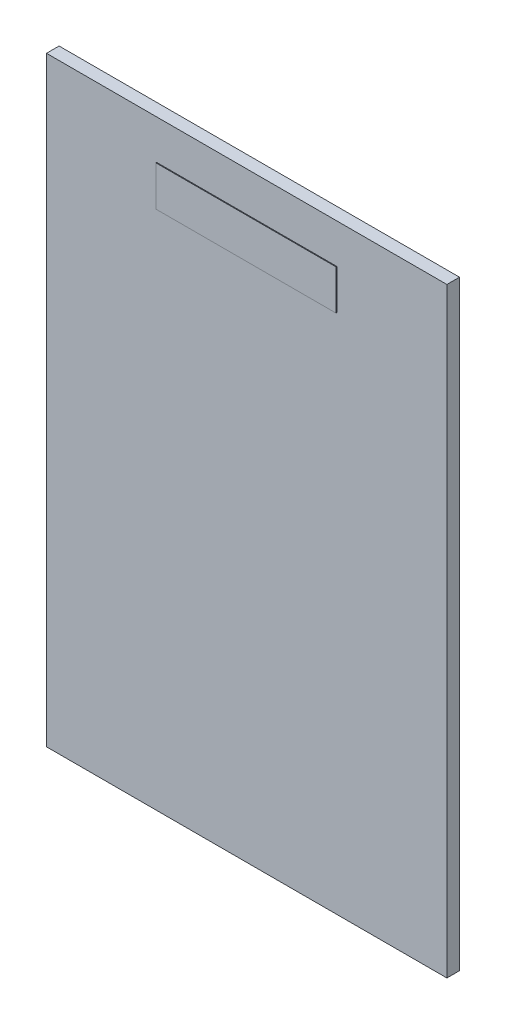
ISO-10303-21;
HEADER;
FILE_DESCRIPTION(('STEP AP214'),'2;1');
FILE_NAME('part.step','',(''),(''),'','','');
FILE_SCHEMA(('AUTOMOTIVE_DESIGN { 1 0 10303 214 1 1 1 1 }'));
ENDSEC;
DATA;
#1=APPLICATION_CONTEXT('core data for automotive mechanical design processes');
#2=APPLICATION_PROTOCOL_DEFINITION('international standard','automotive_design',2000,#1);
#3=PRODUCT_CONTEXT('',#1,'mechanical');
#4=PRODUCT('Part','Part','',(#3));
#5=PRODUCT_RELATED_PRODUCT_CATEGORY('part','',(#4));
#6=PRODUCT_DEFINITION_FORMATION('','',#4);
#7=PRODUCT_DEFINITION_CONTEXT('part definition',#1,'design');
#8=PRODUCT_DEFINITION('design','',#6,#7);
#9=PRODUCT_DEFINITION_SHAPE('','',#8);
#10=(LENGTH_UNIT() NAMED_UNIT(*) SI_UNIT(.MILLI.,.METRE.));
#11=(NAMED_UNIT(*) PLANE_ANGLE_UNIT() SI_UNIT($,.RADIAN.));
#12=(NAMED_UNIT(*) SI_UNIT($,.STERADIAN.) SOLID_ANGLE_UNIT());
#13=UNCERTAINTY_MEASURE_WITH_UNIT(LENGTH_MEASURE(1.E-05),#10,'distance_accuracy_value','');
#14=(GEOMETRIC_REPRESENTATION_CONTEXT(3) GLOBAL_UNCERTAINTY_ASSIGNED_CONTEXT((#13)) GLOBAL_UNIT_ASSIGNED_CONTEXT((#10,
#11,#12)) REPRESENTATION_CONTEXT('',''));
#15=CARTESIAN_POINT('',(0.,0.,0.));
#16=DIRECTION('',(0.,0.,1.));
#17=DIRECTION('',(1.,0.,0.));
#18=AXIS2_PLACEMENT_3D('',#15,#16,#17);
#19=CARTESIAN_POINT('',(0.,0.,0.));
#20=DIRECTION('',(0.,0.,1.));
#21=DIRECTION('',(1.,0.,0.));
#22=AXIS2_PLACEMENT_3D('',#19,#20,#21);
#23=PLANE('',#22);
#24=DIRECTION('',(0.,-1.,0.));
#25=VECTOR('',#24,1.);
#26=CARTESIAN_POINT('',(-25.4,-38.1,0.));
#27=LINE('',#26,#25);
#28=CARTESIAN_POINT('',(-25.4,38.1,0.));
#29=VERTEX_POINT('',#28);
#30=CARTESIAN_POINT('',(-25.4,-38.1,0.));
#31=VERTEX_POINT('',#30);
#32=EDGE_CURVE('E201',#29,#31,#27,.T.);
#33=ORIENTED_EDGE('',*,*,#32,.F.);
#34=DIRECTION('',(-1.,0.,0.));
#35=VECTOR('',#34,1.);
#36=CARTESIAN_POINT('',(25.4,38.1,0.));
#37=LINE('',#36,#35);
#38=CARTESIAN_POINT('',(25.4,38.1,0.));
#39=VERTEX_POINT('',#38);
#40=EDGE_CURVE('E207',#39,#29,#37,.T.);
#41=ORIENTED_EDGE('',*,*,#40,.F.);
#42=DIRECTION('',(0.,1.,0.));
#43=VECTOR('',#42,1.);
#44=CARTESIAN_POINT('',(25.4,-38.1,0.));
#45=LINE('',#44,#43);
#46=CARTESIAN_POINT('',(25.4,-38.1,0.));
#47=VERTEX_POINT('',#46);
#48=EDGE_CURVE('E223',#47,#39,#45,.T.);
#49=ORIENTED_EDGE('',*,*,#48,.F.);
#50=DIRECTION('',(1.,0.,0.));
#51=VECTOR('',#50,1.);
#52=CARTESIAN_POINT('',(25.4,-38.1,0.));
#53=LINE('',#52,#51);
#54=EDGE_CURVE('E220',#31,#47,#53,.T.);
#55=ORIENTED_EDGE('',*,*,#54,.F.);
#56=EDGE_LOOP('',(#33,#41,#49,#55));
#57=FACE_BOUND('',#56,.T.);
#58=DIRECTION('',(0.,-1.,0.));
#59=VECTOR('',#58,1.);
#60=CARTESIAN_POINT('',(14.2785809877324,-19.2782572597997,0.));
#61=LINE('',#60,#59);
#62=CARTESIAN_POINT('',(14.2785809877324,22.7351751149428,0.));
#63=VERTEX_POINT('',#62);
#64=CARTESIAN_POINT('',(14.2785809877324,-19.2782572597997,0.));
#65=VERTEX_POINT('',#64);
#66=EDGE_CURVE('E57',#63,#65,#61,.T.);
#67=ORIENTED_EDGE('',*,*,#66,.F.);
#68=DIRECTION('',(1.,0.,0.));
#69=VECTOR('',#68,1.);
#70=CARTESIAN_POINT('',(-14.2785809877324,22.7351751149428,0.));
#71=LINE('',#70,#69);
#72=CARTESIAN_POINT('',(-14.2785809877324,22.7351751149428,0.));
#73=VERTEX_POINT('',#72);
#74=EDGE_CURVE('E61',#73,#63,#71,.T.);
#75=ORIENTED_EDGE('',*,*,#74,.F.);
#76=DIRECTION('',(0.,1.,0.));
#77=VECTOR('',#76,1.);
#78=CARTESIAN_POINT('',(-14.2785809877324,-19.2782572597997,0.));
#79=LINE('',#78,#77);
#80=CARTESIAN_POINT('',(-14.2785809877324,-19.2782572597997,0.));
#81=VERTEX_POINT('',#80);
#82=EDGE_CURVE('E401',#81,#73,#79,.T.);
#83=ORIENTED_EDGE('',*,*,#82,.F.);
#84=DIRECTION('',(-1.,0.,0.));
#85=VECTOR('',#84,1.);
#86=CARTESIAN_POINT('',(-14.2785809877324,-19.2782572597997,0.));
#87=LINE('',#86,#85);
#88=EDGE_CURVE('E411',#65,#81,#87,.T.);
#89=ORIENTED_EDGE('',*,*,#88,.F.);
#90=EDGE_LOOP('',(#67,#75,#83,#89));
#91=FACE_BOUND('',#90,.T.);
#92=ADVANCED_FACE('F41',(#57,#91),#23,.F.);
#93=CARTESIAN_POINT('',(0.,0.,1.6));
#94=DIRECTION('',(0.,0.,1.));
#95=DIRECTION('',(1.,0.,0.));
#96=AXIS2_PLACEMENT_3D('',#93,#94,#95);
#97=PLANE('',#96);
#98=DIRECTION('',(0.,-1.,0.));
#99=VECTOR('',#98,1.);
#100=CARTESIAN_POINT('',(-25.4,-38.1,1.6));
#101=LINE('',#100,#99);
#102=CARTESIAN_POINT('',(-25.4,38.1,1.6));
#103=VERTEX_POINT('',#102);
#104=CARTESIAN_POINT('',(-25.4,-38.1,1.6));
#105=VERTEX_POINT('',#104);
#106=EDGE_CURVE('E202',#103,#105,#101,.T.);
#107=ORIENTED_EDGE('',*,*,#106,.T.);
#108=DIRECTION('',(1.,0.,0.));
#109=VECTOR('',#108,1.);
#110=CARTESIAN_POINT('',(25.4,-38.1,1.6));
#111=LINE('',#110,#109);
#112=CARTESIAN_POINT('',(25.4,-38.1,1.6));
#113=VERTEX_POINT('',#112);
#114=EDGE_CURVE('E206',#105,#113,#111,.T.);
#115=ORIENTED_EDGE('',*,*,#114,.T.);
#116=DIRECTION('',(0.,1.,0.));
#117=VECTOR('',#116,1.);
#118=CARTESIAN_POINT('',(25.4,-38.1,1.6));
#119=LINE('',#118,#117);
#120=CARTESIAN_POINT('',(25.4,38.1,1.6));
#121=VERTEX_POINT('',#120);
#122=EDGE_CURVE('E210',#113,#121,#119,.T.);
#123=ORIENTED_EDGE('',*,*,#122,.T.);
#124=DIRECTION('',(-1.,0.,0.));
#125=VECTOR('',#124,1.);
#126=CARTESIAN_POINT('',(25.4,38.1,1.6));
#127=LINE('',#126,#125);
#128=EDGE_CURVE('E213',#121,#103,#127,.T.);
#129=ORIENTED_EDGE('',*,*,#128,.T.);
#130=EDGE_LOOP('',(#107,#115,#123,#129));
#131=FACE_BOUND('',#130,.T.);
#132=DIRECTION('',(-1.,0.,0.));
#133=VECTOR('',#132,1.);
#134=CARTESIAN_POINT('',(-11.43,33.1,1.6));
#135=LINE('',#134,#133);
#136=CARTESIAN_POINT('',(11.43,33.1,1.6));
#137=VERTEX_POINT('',#136);
#138=CARTESIAN_POINT('',(-11.43,33.1,1.6));
#139=VERTEX_POINT('',#138);
#140=EDGE_CURVE('E159',#137,#139,#135,.T.);
#141=ORIENTED_EDGE('',*,*,#140,.F.);
#142=DIRECTION('',(0.,1.,0.));
#143=VECTOR('',#142,1.);
#144=CARTESIAN_POINT('',(11.43,28.02,1.6));
#145=LINE('',#144,#143);
#146=CARTESIAN_POINT('',(11.43,28.02,1.6));
#147=VERTEX_POINT('',#146);
#148=EDGE_CURVE('E154',#147,#137,#145,.T.);
#149=ORIENTED_EDGE('',*,*,#148,.F.);
#150=DIRECTION('',(1.,0.,0.));
#151=VECTOR('',#150,1.);
#152=CARTESIAN_POINT('',(-11.43,28.02,1.6));
#153=LINE('',#152,#151);
#154=CARTESIAN_POINT('',(-11.43,28.02,1.6));
#155=VERTEX_POINT('',#154);
#156=EDGE_CURVE('E170',#155,#147,#153,.T.);
#157=ORIENTED_EDGE('',*,*,#156,.F.);
#158=DIRECTION('',(0.,-1.,0.));
#159=VECTOR('',#158,1.);
#160=CARTESIAN_POINT('',(-11.43,28.02,1.6));
#161=LINE('',#160,#159);
#162=EDGE_CURVE('E182',#139,#155,#161,.T.);
#163=ORIENTED_EDGE('',*,*,#162,.F.);
#164=EDGE_LOOP('',(#141,#149,#157,#163));
#165=FACE_BOUND('',#164,.T.);
#166=ADVANCED_FACE('F254',(#131,#165),#97,.T.);
#167=CARTESIAN_POINT('',(-25.4,-38.1,1.6));
#168=DIRECTION('',(1.,0.,0.));
#169=DIRECTION('',(0.,0.,-1.));
#170=AXIS2_PLACEMENT_3D('',#167,#168,#169);
#171=PLANE('',#170);
#172=ORIENTED_EDGE('',*,*,#32,.T.);
#173=DIRECTION('',(0.,0.,-1.));
#174=VECTOR('',#173,1.);
#175=CARTESIAN_POINT('',(-25.4,-38.1,1.6));
#176=LINE('',#175,#174);
#177=EDGE_CURVE('E11',#105,#31,#176,.T.);
#178=ORIENTED_EDGE('',*,*,#177,.F.);
#179=ORIENTED_EDGE('',*,*,#106,.F.);
#180=DIRECTION('',(0.,0.,-1.));
#181=VECTOR('',#180,1.);
#182=CARTESIAN_POINT('',(-25.4,38.1,1.6));
#183=LINE('',#182,#181);
#184=EDGE_CURVE('E216',#103,#29,#183,.T.);
#185=ORIENTED_EDGE('',*,*,#184,.T.);
#186=EDGE_LOOP('',(#172,#178,#179,#185));
#187=FACE_BOUND('',#186,.T.);
#188=ADVANCED_FACE('F43',(#187),#171,.F.);
#189=CARTESIAN_POINT('',(25.4,-38.1,1.6));
#190=DIRECTION('',(0.,1.,0.));
#191=DIRECTION('',(-1.,0.,0.));
#192=AXIS2_PLACEMENT_3D('',#189,#190,#191);
#193=PLANE('',#192);
#194=ORIENTED_EDGE('',*,*,#54,.T.);
#195=DIRECTION('',(0.,0.,-1.));
#196=VECTOR('',#195,1.);
#197=CARTESIAN_POINT('',(25.4,-38.1,1.6));
#198=LINE('',#197,#196);
#199=EDGE_CURVE('E50',#113,#47,#198,.T.);
#200=ORIENTED_EDGE('',*,*,#199,.F.);
#201=ORIENTED_EDGE('',*,*,#114,.F.);
#202=ORIENTED_EDGE('',*,*,#177,.T.);
#203=EDGE_LOOP('',(#194,#200,#201,#202));
#204=FACE_BOUND('',#203,.T.);
#205=ADVANCED_FACE('F256',(#204),#193,.F.);
#206=CARTESIAN_POINT('',(25.4,-38.1,1.6));
#207=DIRECTION('',(-1.,0.,0.));
#208=DIRECTION('',(0.,0.,1.));
#209=AXIS2_PLACEMENT_3D('',#206,#207,#208);
#210=PLANE('',#209);
#211=ORIENTED_EDGE('',*,*,#48,.T.);
#212=DIRECTION('',(0.,0.,-1.));
#213=VECTOR('',#212,1.);
#214=CARTESIAN_POINT('',(25.4,38.1,1.6));
#215=LINE('',#214,#213);
#216=EDGE_CURVE('E231',#121,#39,#215,.T.);
#217=ORIENTED_EDGE('',*,*,#216,.F.);
#218=ORIENTED_EDGE('',*,*,#122,.F.);
#219=ORIENTED_EDGE('',*,*,#199,.T.);
#220=EDGE_LOOP('',(#211,#217,#218,#219));
#221=FACE_BOUND('',#220,.T.);
#222=ADVANCED_FACE('F240',(#221),#210,.F.);
#223=CARTESIAN_POINT('',(25.4,38.1,1.6));
#224=DIRECTION('',(0.,-1.,0.));
#225=DIRECTION('',(0.,0.,-1.));
#226=AXIS2_PLACEMENT_3D('',#223,#224,#225);
#227=PLANE('',#226);
#228=ORIENTED_EDGE('',*,*,#40,.T.);
#229=ORIENTED_EDGE('',*,*,#184,.F.);
#230=ORIENTED_EDGE('',*,*,#128,.F.);
#231=ORIENTED_EDGE('',*,*,#216,.T.);
#232=EDGE_LOOP('',(#228,#229,#230,#231));
#233=FACE_BOUND('',#232,.T.);
#234=ADVANCED_FACE('F248',(#233),#227,.F.);
#235=CARTESIAN_POINT('',(11.43,28.02,1.7));
#236=DIRECTION('',(-1.,0.,0.));
#237=DIRECTION('',(0.,0.,1.));
#238=AXIS2_PLACEMENT_3D('',#235,#236,#237);
#239=PLANE('',#238);
#240=ORIENTED_EDGE('',*,*,#148,.T.);
#241=DIRECTION('',(0.,0.,-1.));
#242=VECTOR('',#241,1.);
#243=CARTESIAN_POINT('',(11.43,33.1,1.7));
#244=LINE('',#243,#242);
#245=CARTESIAN_POINT('',(11.43,33.1,1.7));
#246=VERTEX_POINT('',#245);
#247=EDGE_CURVE('E198',#246,#137,#244,.T.);
#248=ORIENTED_EDGE('',*,*,#247,.F.);
#249=DIRECTION('',(0.,1.,0.));
#250=VECTOR('',#249,1.);
#251=CARTESIAN_POINT('',(11.43,28.02,1.7));
#252=LINE('',#251,#250);
#253=CARTESIAN_POINT('',(11.43,28.02,1.7));
#254=VERTEX_POINT('',#253);
#255=EDGE_CURVE('E165',#254,#246,#252,.T.);
#256=ORIENTED_EDGE('',*,*,#255,.F.);
#257=DIRECTION('',(0.,0.,-1.));
#258=VECTOR('',#257,1.);
#259=CARTESIAN_POINT('',(11.43,28.02,1.7));
#260=LINE('',#259,#258);
#261=EDGE_CURVE('E178',#254,#147,#260,.T.);
#262=ORIENTED_EDGE('',*,*,#261,.T.);
#263=EDGE_LOOP('',(#240,#248,#256,#262));
#264=FACE_BOUND('',#263,.T.);
#265=ADVANCED_FACE('F272',(#264),#239,.F.);
#266=CARTESIAN_POINT('',(-11.43,33.1,1.7));
#267=DIRECTION('',(0.,-1.,0.));
#268=DIRECTION('',(0.,0.,-1.));
#269=AXIS2_PLACEMENT_3D('',#266,#267,#268);
#270=PLANE('',#269);
#271=ORIENTED_EDGE('',*,*,#140,.T.);
#272=DIRECTION('',(0.,0.,-1.));
#273=VECTOR('',#272,1.);
#274=CARTESIAN_POINT('',(-11.43,33.1,1.7));
#275=LINE('',#274,#273);
#276=CARTESIAN_POINT('',(-11.43,33.1,1.7));
#277=VERTEX_POINT('',#276);
#278=EDGE_CURVE('E194',#277,#139,#275,.T.);
#279=ORIENTED_EDGE('',*,*,#278,.F.);
#280=DIRECTION('',(-1.,0.,0.));
#281=VECTOR('',#280,1.);
#282=CARTESIAN_POINT('',(-11.43,33.1,1.7));
#283=LINE('',#282,#281);
#284=EDGE_CURVE('E169',#246,#277,#283,.T.);
#285=ORIENTED_EDGE('',*,*,#284,.F.);
#286=ORIENTED_EDGE('',*,*,#247,.T.);
#287=EDGE_LOOP('',(#271,#279,#285,#286));
#288=FACE_BOUND('',#287,.T.);
#289=ADVANCED_FACE('F276',(#288),#270,.F.);
#290=CARTESIAN_POINT('',(-11.43,28.02,1.7));
#291=DIRECTION('',(1.,0.,0.));
#292=DIRECTION('',(0.,0.,-1.));
#293=AXIS2_PLACEMENT_3D('',#290,#291,#292);
#294=PLANE('',#293);
#295=ORIENTED_EDGE('',*,*,#162,.T.);
#296=DIRECTION('',(0.,0.,-1.));
#297=VECTOR('',#296,1.);
#298=CARTESIAN_POINT('',(-11.43,28.02,1.7));
#299=LINE('',#298,#297);
#300=CARTESIAN_POINT('',(-11.43,28.02,1.7));
#301=VERTEX_POINT('',#300);
#302=EDGE_CURVE('E191',#301,#155,#299,.T.);
#303=ORIENTED_EDGE('',*,*,#302,.F.);
#304=DIRECTION('',(0.,-1.,0.));
#305=VECTOR('',#304,1.);
#306=CARTESIAN_POINT('',(-11.43,28.02,1.7));
#307=LINE('',#306,#305);
#308=EDGE_CURVE('E173',#277,#301,#307,.T.);
#309=ORIENTED_EDGE('',*,*,#308,.F.);
#310=ORIENTED_EDGE('',*,*,#278,.T.);
#311=EDGE_LOOP('',(#295,#303,#309,#310));
#312=FACE_BOUND('',#311,.T.);
#313=ADVANCED_FACE('F281',(#312),#294,.F.);
#314=CARTESIAN_POINT('',(-11.43,28.02,1.7));
#315=DIRECTION('',(0.,1.,0.));
#316=DIRECTION('',(0.,0.,1.));
#317=AXIS2_PLACEMENT_3D('',#314,#315,#316);
#318=PLANE('',#317);
#319=ORIENTED_EDGE('',*,*,#156,.T.);
#320=ORIENTED_EDGE('',*,*,#261,.F.);
#321=DIRECTION('',(1.,0.,0.));
#322=VECTOR('',#321,1.);
#323=CARTESIAN_POINT('',(-11.43,28.02,1.7));
#324=LINE('',#323,#322);
#325=EDGE_CURVE('E176',#301,#254,#324,.T.);
#326=ORIENTED_EDGE('',*,*,#325,.F.);
#327=ORIENTED_EDGE('',*,*,#302,.T.);
#328=EDGE_LOOP('',(#319,#320,#326,#327));
#329=FACE_BOUND('',#328,.T.);
#330=ADVANCED_FACE('F287',(#329),#318,.F.);
#331=CARTESIAN_POINT('',(0.,0.,1.7));
#332=DIRECTION('',(0.,0.,-1.));
#333=DIRECTION('',(-1.,0.,0.));
#334=AXIS2_PLACEMENT_3D('',#331,#332,#333);
#335=PLANE('',#334);
#336=ORIENTED_EDGE('',*,*,#255,.T.);
#337=ORIENTED_EDGE('',*,*,#284,.T.);
#338=ORIENTED_EDGE('',*,*,#308,.T.);
#339=ORIENTED_EDGE('',*,*,#325,.T.);
#340=EDGE_LOOP('',(#336,#337,#338,#339));
#341=FACE_BOUND('',#340,.T.);
#342=ADVANCED_FACE('F291',(#341),#335,.F.);
#343=CARTESIAN_POINT('',(14.2785809877324,-19.2782572597997,-2.));
#344=DIRECTION('',(-1.,0.,0.));
#345=DIRECTION('',(0.,0.,1.));
#346=AXIS2_PLACEMENT_3D('',#343,#344,#345);
#347=PLANE('',#346);
#348=ORIENTED_EDGE('',*,*,#66,.T.);
#349=DIRECTION('',(0.,0.,1.));
#350=VECTOR('',#349,1.);
#351=CARTESIAN_POINT('',(14.2785809877324,-19.2782572597997,-2.));
#352=LINE('',#351,#350);
#353=CARTESIAN_POINT('',(14.2785809877324,-19.2782572597997,-2.));
#354=VERTEX_POINT('',#353);
#355=EDGE_CURVE('E134',#354,#65,#352,.T.);
#356=ORIENTED_EDGE('',*,*,#355,.F.);
#357=DIRECTION('',(0.,-1.,0.));
#358=VECTOR('',#357,1.);
#359=CARTESIAN_POINT('',(14.2785809877324,-19.2782572597997,-2.));
#360=LINE('',#359,#358);
#361=CARTESIAN_POINT('',(14.2785809877324,22.7351751149428,-2.));
#362=VERTEX_POINT('',#361);
#363=EDGE_CURVE('E141',#362,#354,#360,.T.);
#364=ORIENTED_EDGE('',*,*,#363,.F.);
#365=DIRECTION('',(0.,0.,1.));
#366=VECTOR('',#365,1.);
#367=CARTESIAN_POINT('',(14.2785809877324,22.7351751149428,-2.));
#368=LINE('',#367,#366);
#369=EDGE_CURVE('E398',#362,#63,#368,.T.);
#370=ORIENTED_EDGE('',*,*,#369,.T.);
#371=EDGE_LOOP('',(#348,#356,#364,#370));
#372=FACE_BOUND('',#371,.T.);
#373=ADVANCED_FACE('F152',(#372),#347,.F.);
#374=CARTESIAN_POINT('',(-14.2785809877324,-19.2782572597997,-2.));
#375=DIRECTION('',(0.,1.,0.));
#376=DIRECTION('',(-1.,0.,0.));
#377=AXIS2_PLACEMENT_3D('',#374,#375,#376);
#378=PLANE('',#377);
#379=ORIENTED_EDGE('',*,*,#88,.T.);
#380=DIRECTION('',(0.,0.,1.));
#381=VECTOR('',#380,1.);
#382=CARTESIAN_POINT('',(-14.2785809877324,-19.2782572597997,-2.));
#383=LINE('',#382,#381);
#384=CARTESIAN_POINT('',(-14.2785809877324,-19.2782572597997,-2.));
#385=VERTEX_POINT('',#384);
#386=EDGE_CURVE('E136',#385,#81,#383,.T.);
#387=ORIENTED_EDGE('',*,*,#386,.F.);
#388=DIRECTION('',(-1.,0.,0.));
#389=VECTOR('',#388,1.);
#390=CARTESIAN_POINT('',(-14.2785809877324,-19.2782572597997,-2.));
#391=LINE('',#390,#389);
#392=EDGE_CURVE('E129',#354,#385,#391,.T.);
#393=ORIENTED_EDGE('',*,*,#392,.F.);
#394=ORIENTED_EDGE('',*,*,#355,.T.);
#395=EDGE_LOOP('',(#379,#387,#393,#394));
#396=FACE_BOUND('',#395,.T.);
#397=ADVANCED_FACE('F132',(#396),#378,.F.);
#398=CARTESIAN_POINT('',(-14.2785809877324,-19.2782572597997,-2.));
#399=DIRECTION('',(1.,0.,0.));
#400=DIRECTION('',(0.,0.,-1.));
#401=AXIS2_PLACEMENT_3D('',#398,#399,#400);
#402=PLANE('',#401);
#403=ORIENTED_EDGE('',*,*,#82,.T.);
#404=DIRECTION('',(0.,0.,1.));
#405=VECTOR('',#404,1.);
#406=CARTESIAN_POINT('',(-14.2785809877324,22.7351751149428,-2.));
#407=LINE('',#406,#405);
#408=CARTESIAN_POINT('',(-14.2785809877324,22.7351751149428,-2.));
#409=VERTEX_POINT('',#408);
#410=EDGE_CURVE('E161',#409,#73,#407,.T.);
#411=ORIENTED_EDGE('',*,*,#410,.F.);
#412=DIRECTION('',(0.,1.,0.));
#413=VECTOR('',#412,1.);
#414=CARTESIAN_POINT('',(-14.2785809877324,-19.2782572597997,-2.));
#415=LINE('',#414,#413);
#416=EDGE_CURVE('E140',#385,#409,#415,.T.);
#417=ORIENTED_EDGE('',*,*,#416,.F.);
#418=ORIENTED_EDGE('',*,*,#386,.T.);
#419=EDGE_LOOP('',(#403,#411,#417,#418));
#420=FACE_BOUND('',#419,.T.);
#421=ADVANCED_FACE('F300',(#420),#402,.F.);
#422=CARTESIAN_POINT('',(-14.2785809877324,22.7351751149428,-2.));
#423=DIRECTION('',(0.,-1.,0.));
#424=DIRECTION('',(0.,0.,-1.));
#425=AXIS2_PLACEMENT_3D('',#422,#423,#424);
#426=PLANE('',#425);
#427=ORIENTED_EDGE('',*,*,#74,.T.);
#428=ORIENTED_EDGE('',*,*,#369,.F.);
#429=DIRECTION('',(1.,0.,0.));
#430=VECTOR('',#429,1.);
#431=CARTESIAN_POINT('',(-14.2785809877324,22.7351751149428,-2.));
#432=LINE('',#431,#430);
#433=EDGE_CURVE('E146',#409,#362,#432,.T.);
#434=ORIENTED_EDGE('',*,*,#433,.F.);
#435=ORIENTED_EDGE('',*,*,#410,.T.);
#436=EDGE_LOOP('',(#427,#428,#434,#435));
#437=FACE_BOUND('',#436,.T.);
#438=ADVANCED_FACE('F303',(#437),#426,.F.);
#439=CARTESIAN_POINT('',(0.,0.,-2.));
#440=DIRECTION('',(0.,0.,-1.));
#441=DIRECTION('',(-1.,0.,0.));
#442=AXIS2_PLACEMENT_3D('',#439,#440,#441);
#443=PLANE('',#442);
#444=ORIENTED_EDGE('',*,*,#363,.T.);
#445=ORIENTED_EDGE('',*,*,#392,.T.);
#446=ORIENTED_EDGE('',*,*,#416,.T.);
#447=ORIENTED_EDGE('',*,*,#433,.T.);
#448=EDGE_LOOP('',(#444,#445,#446,#447));
#449=FACE_BOUND('',#448,.T.);
#450=ADVANCED_FACE('F144',(#449),#443,.T.);
#451=CLOSED_SHELL('',(#92,#166,#188,#205,#222,#234,#265,#289,#313,#330,#342,#373,#397,#421,#438,#450));
#452=MANIFOLD_SOLID_BREP('B2',#451);
#453=ADVANCED_BREP_SHAPE_REPRESENTATION('',(#18,#452),#14);
#454=SHAPE_DEFINITION_REPRESENTATION(#9,#453);
ENDSEC;
END-ISO-10303-21;
